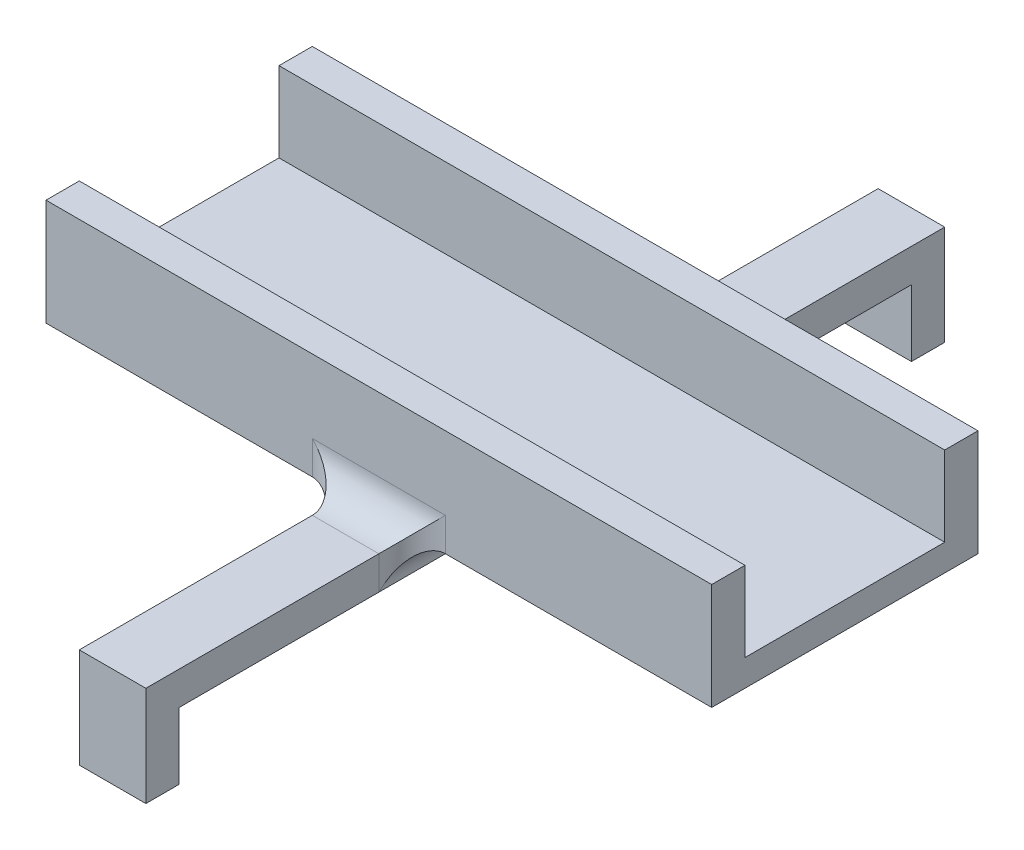
ISO-10303-21;
HEADER;
FILE_DESCRIPTION(('STEP AP214'),'2;1');
FILE_NAME('part.step','',(''),(''),'','','');
FILE_SCHEMA(('AUTOMOTIVE_DESIGN { 1 0 10303 214 1 1 1 1 }'));
ENDSEC;
DATA;
#1=APPLICATION_CONTEXT('core data for automotive mechanical design processes');
#2=APPLICATION_PROTOCOL_DEFINITION('international standard','automotive_design',2000,#1);
#3=PRODUCT_CONTEXT('',#1,'mechanical');
#4=PRODUCT('Part','Part','',(#3));
#5=PRODUCT_RELATED_PRODUCT_CATEGORY('part','',(#4));
#6=PRODUCT_DEFINITION_FORMATION('','',#4);
#7=PRODUCT_DEFINITION_CONTEXT('part definition',#1,'design');
#8=PRODUCT_DEFINITION('design','',#6,#7);
#9=PRODUCT_DEFINITION_SHAPE('','',#8);
#10=(LENGTH_UNIT() NAMED_UNIT(*) SI_UNIT(.MILLI.,.METRE.));
#11=(NAMED_UNIT(*) PLANE_ANGLE_UNIT() SI_UNIT($,.RADIAN.));
#12=(NAMED_UNIT(*) SI_UNIT($,.STERADIAN.) SOLID_ANGLE_UNIT());
#13=UNCERTAINTY_MEASURE_WITH_UNIT(LENGTH_MEASURE(1.E-05),#10,'distance_accuracy_value','');
#14=(GEOMETRIC_REPRESENTATION_CONTEXT(3) GLOBAL_UNCERTAINTY_ASSIGNED_CONTEXT((#13)) GLOBAL_UNIT_ASSIGNED_CONTEXT((#10,
#11,#12)) REPRESENTATION_CONTEXT('',''));
#15=CARTESIAN_POINT('',(0.,0.,0.));
#16=DIRECTION('',(0.,0.,1.));
#17=DIRECTION('',(1.,0.,0.));
#18=AXIS2_PLACEMENT_3D('',#15,#16,#17);
#19=CARTESIAN_POINT('',(-5.,-5.,60.));
#20=DIRECTION('',(1.,0.,0.));
#21=DIRECTION('',(0.,0.,-1.));
#22=AXIS2_PLACEMENT_3D('',#19,#20,#21);
#23=PLANE('',#22);
#24=DIRECTION('',(0.,0.,-1.));
#25=VECTOR('',#24,1.);
#26=CARTESIAN_POINT('',(-5.,-5.,60.));
#27=LINE('',#26,#25);
#28=CARTESIAN_POINT('',(-5.,-5.,-25.));
#29=VERTEX_POINT('',#28);
#30=CARTESIAN_POINT('',(-5.,-5.,-55.));
#31=VERTEX_POINT('',#30);
#32=EDGE_CURVE('E262',#29,#31,#27,.T.);
#33=ORIENTED_EDGE('',*,*,#32,.F.);
#34=DIRECTION('',(0.,1.,0.));
#35=VECTOR('',#34,1.);
#36=CARTESIAN_POINT('',(-5.,0.,-25.));
#37=LINE('',#36,#35);
#38=CARTESIAN_POINT('',(-5.,0.,-25.));
#39=VERTEX_POINT('',#38);
#40=EDGE_CURVE('E416',#29,#39,#37,.T.);
#41=ORIENTED_EDGE('',*,*,#40,.T.);
#42=DIRECTION('',(0.,0.,-1.));
#43=VECTOR('',#42,1.);
#44=CARTESIAN_POINT('',(-5.,0.,60.));
#45=LINE('',#44,#43);
#46=CARTESIAN_POINT('',(-5.,0.,-60.));
#47=VERTEX_POINT('',#46);
#48=EDGE_CURVE('E276',#39,#47,#45,.T.);
#49=ORIENTED_EDGE('',*,*,#48,.T.);
#50=DIRECTION('',(0.,1.,0.));
#51=VECTOR('',#50,1.);
#52=CARTESIAN_POINT('',(-5.,-5.,-60.));
#53=LINE('',#52,#51);
#54=CARTESIAN_POINT('',(-5.,-15.,-60.));
#55=VERTEX_POINT('',#54);
#56=EDGE_CURVE('E286',#55,#47,#53,.T.);
#57=ORIENTED_EDGE('',*,*,#56,.F.);
#58=DIRECTION('',(0.,0.,-1.));
#59=VECTOR('',#58,1.);
#60=CARTESIAN_POINT('',(-5.,-15.,-55.));
#61=LINE('',#60,#59);
#62=CARTESIAN_POINT('',(-5.,-15.,-55.));
#63=VERTEX_POINT('',#62);
#64=EDGE_CURVE('E209',#63,#55,#61,.T.);
#65=ORIENTED_EDGE('',*,*,#64,.F.);
#66=DIRECTION('',(0.,1.,0.));
#67=VECTOR('',#66,1.);
#68=CARTESIAN_POINT('',(-5.,-15.,-55.));
#69=LINE('',#68,#67);
#70=EDGE_CURVE('E204',#63,#31,#69,.T.);
#71=ORIENTED_EDGE('',*,*,#70,.T.);
#72=EDGE_LOOP('',(#33,#41,#49,#57,#65,#71));
#73=FACE_BOUND('',#72,.T.);
#74=ADVANCED_FACE('F38',(#73),#23,.F.);
#75=CARTESIAN_POINT('',(5.,-5.,60.));
#76=DIRECTION('',(-1.,0.,0.));
#77=DIRECTION('',(0.,0.,1.));
#78=AXIS2_PLACEMENT_3D('',#75,#76,#77);
#79=PLANE('',#78);
#80=DIRECTION('',(0.,0.,1.));
#81=VECTOR('',#80,1.);
#82=CARTESIAN_POINT('',(5.,-5.,60.));
#83=LINE('',#82,#81);
#84=CARTESIAN_POINT('',(5.,-5.,25.));
#85=VERTEX_POINT('',#84);
#86=CARTESIAN_POINT('',(5.,-5.,55.));
#87=VERTEX_POINT('',#86);
#88=EDGE_CURVE('E263',#85,#87,#83,.T.);
#89=ORIENTED_EDGE('',*,*,#88,.F.);
#90=DIRECTION('',(0.,1.,0.));
#91=VECTOR('',#90,1.);
#92=CARTESIAN_POINT('',(5.,0.,25.));
#93=LINE('',#92,#91);
#94=CARTESIAN_POINT('',(5.,0.,25.));
#95=VERTEX_POINT('',#94);
#96=EDGE_CURVE('E423',#85,#95,#93,.T.);
#97=ORIENTED_EDGE('',*,*,#96,.T.);
#98=DIRECTION('',(0.,0.,1.));
#99=VECTOR('',#98,1.);
#100=CARTESIAN_POINT('',(5.,0.,60.));
#101=LINE('',#100,#99);
#102=CARTESIAN_POINT('',(5.,0.,60.));
#103=VERTEX_POINT('',#102);
#104=EDGE_CURVE('E259',#95,#103,#101,.T.);
#105=ORIENTED_EDGE('',*,*,#104,.T.);
#106=DIRECTION('',(0.,1.,0.));
#107=VECTOR('',#106,1.);
#108=CARTESIAN_POINT('',(5.,-5.,60.));
#109=LINE('',#108,#107);
#110=CARTESIAN_POINT('',(5.,-15.,60.));
#111=VERTEX_POINT('',#110);
#112=EDGE_CURVE('E294',#111,#103,#109,.T.);
#113=ORIENTED_EDGE('',*,*,#112,.F.);
#114=DIRECTION('',(0.,0.,1.));
#115=VECTOR('',#114,1.);
#116=CARTESIAN_POINT('',(5.,-15.,60.));
#117=LINE('',#116,#115);
#118=CARTESIAN_POINT('',(5.,-15.,55.));
#119=VERTEX_POINT('',#118);
#120=EDGE_CURVE('E233',#119,#111,#117,.T.);
#121=ORIENTED_EDGE('',*,*,#120,.F.);
#122=DIRECTION('',(0.,1.,0.));
#123=VECTOR('',#122,1.);
#124=CARTESIAN_POINT('',(5.,-15.,55.));
#125=LINE('',#124,#123);
#126=EDGE_CURVE('E250',#119,#87,#125,.T.);
#127=ORIENTED_EDGE('',*,*,#126,.T.);
#128=EDGE_LOOP('',(#89,#97,#105,#113,#121,#127));
#129=FACE_BOUND('',#128,.T.);
#130=ADVANCED_FACE('F480',(#129),#79,.F.);
#131=CARTESIAN_POINT('',(0.,-5.,0.));
#132=DIRECTION('',(0.,-1.,0.));
#133=DIRECTION('',(0.,0.,-1.));
#134=AXIS2_PLACEMENT_3D('',#131,#132,#133);
#135=PLANE('',#134);
#136=CARTESIAN_POINT('',(-5.,-5.,55.));
#137=VERTEX_POINT('',#136);
#138=CARTESIAN_POINT('',(-5.,-5.,25.));
#139=VERTEX_POINT('',#138);
#140=EDGE_CURVE('E264',#137,#139,#27,.T.);
#141=ORIENTED_EDGE('',*,*,#140,.T.);
#142=EDGE_CURVE('E269',#139,#29,#27,.T.);
#143=ORIENTED_EDGE('',*,*,#142,.T.);
#144=ORIENTED_EDGE('',*,*,#32,.T.);
#145=DIRECTION('',(-1.,0.,0.));
#146=VECTOR('',#145,1.);
#147=CARTESIAN_POINT('',(-5.,-5.,-55.));
#148=LINE('',#147,#146);
#149=CARTESIAN_POINT('',(5.,-5.,-55.));
#150=VERTEX_POINT('',#149);
#151=EDGE_CURVE('E220',#150,#31,#148,.T.);
#152=ORIENTED_EDGE('',*,*,#151,.F.);
#153=CARTESIAN_POINT('',(5.,-5.,-25.));
#154=VERTEX_POINT('',#153);
#155=EDGE_CURVE('E226',#150,#154,#83,.T.);
#156=ORIENTED_EDGE('',*,*,#155,.T.);
#157=EDGE_CURVE('E57',#154,#85,#83,.T.);
#158=ORIENTED_EDGE('',*,*,#157,.T.);
#159=ORIENTED_EDGE('',*,*,#88,.T.);
#160=DIRECTION('',(1.,0.,0.));
#161=VECTOR('',#160,1.);
#162=CARTESIAN_POINT('',(-5.,-5.,55.));
#163=LINE('',#162,#161);
#164=EDGE_CURVE('E228',#137,#87,#163,.T.);
#165=ORIENTED_EDGE('',*,*,#164,.F.);
#166=EDGE_LOOP('',(#141,#143,#144,#152,#156,#158,#159,#165));
#167=FACE_BOUND('',#166,.T.);
#168=ADVANCED_FACE('F461',(#167),#135,.T.);
#169=CARTESIAN_POINT('',(0.,0.,0.));
#170=DIRECTION('',(0.,1.,0.));
#171=DIRECTION('',(0.,0.,1.));
#172=AXIS2_PLACEMENT_3D('',#169,#170,#171);
#173=PLANE('',#172);
#174=DIRECTION('',(1.,0.,0.));
#175=VECTOR('',#174,1.);
#176=CARTESIAN_POINT('',(-50.,0.,20.));
#177=LINE('',#176,#175);
#178=CARTESIAN_POINT('',(10.,0.,20.));
#179=VERTEX_POINT('',#178);
#180=CARTESIAN_POINT('',(50.,0.,20.));
#181=VERTEX_POINT('',#180);
#182=EDGE_CURVE('E362',#179,#181,#177,.T.);
#183=ORIENTED_EDGE('',*,*,#182,.F.);
#184=DIRECTION('',(0.,0.,1.));
#185=VECTOR('',#184,1.);
#186=CARTESIAN_POINT('',(10.,0.,-20.));
#187=LINE('',#186,#185);
#188=CARTESIAN_POINT('',(10.,0.,-20.));
#189=VERTEX_POINT('',#188);
#190=EDGE_CURVE('E382',#179,#189,#187,.F.);
#191=ORIENTED_EDGE('',*,*,#190,.T.);
#192=DIRECTION('',(-1.,0.,0.));
#193=VECTOR('',#192,1.);
#194=CARTESIAN_POINT('',(-50.,0.,-20.));
#195=LINE('',#194,#193);
#196=CARTESIAN_POINT('',(50.,0.,-20.));
#197=VERTEX_POINT('',#196);
#198=EDGE_CURVE('E355',#197,#189,#195,.T.);
#199=ORIENTED_EDGE('',*,*,#198,.F.);
#200=DIRECTION('',(0.,0.,-1.));
#201=VECTOR('',#200,1.);
#202=CARTESIAN_POINT('',(50.,0.,-20.));
#203=LINE('',#202,#201);
#204=EDGE_CURVE('E324',#181,#197,#203,.T.);
#205=ORIENTED_EDGE('',*,*,#204,.F.);
#206=EDGE_LOOP('',(#183,#191,#199,#205));
#207=FACE_BOUND('',#206,.T.);
#208=ADVANCED_FACE('F567',(#207),#173,.F.);
#209=CARTESIAN_POINT('',(-9.99999999999999,0.,-20.));
#210=VERTEX_POINT('',#209);
#211=CARTESIAN_POINT('',(-50.,0.,-20.));
#212=VERTEX_POINT('',#211);
#213=EDGE_CURVE('E354',#210,#212,#195,.T.);
#214=ORIENTED_EDGE('',*,*,#213,.F.);
#215=DIRECTION('',(0.,0.,-1.));
#216=VECTOR('',#215,1.);
#217=CARTESIAN_POINT('',(-10.,0.,20.));
#218=LINE('',#217,#216);
#219=CARTESIAN_POINT('',(-9.99999999999999,0.,20.));
#220=VERTEX_POINT('',#219);
#221=EDGE_CURVE('E386',#210,#220,#218,.F.);
#222=ORIENTED_EDGE('',*,*,#221,.T.);
#223=CARTESIAN_POINT('',(-50.,0.,20.));
#224=VERTEX_POINT('',#223);
#225=EDGE_CURVE('E363',#224,#220,#177,.T.);
#226=ORIENTED_EDGE('',*,*,#225,.F.);
#227=DIRECTION('',(0.,0.,1.));
#228=VECTOR('',#227,1.);
#229=CARTESIAN_POINT('',(-50.,0.,-20.));
#230=LINE('',#229,#228);
#231=EDGE_CURVE('E359',#212,#224,#230,.T.);
#232=ORIENTED_EDGE('',*,*,#231,.F.);
#233=EDGE_LOOP('',(#214,#222,#226,#232));
#234=FACE_BOUND('',#233,.T.);
#235=ADVANCED_FACE('F521',(#234),#173,.F.);
#236=CARTESIAN_POINT('',(0.,16.,0.));
#237=DIRECTION('',(0.,1.,0.));
#238=DIRECTION('',(0.,0.,1.));
#239=AXIS2_PLACEMENT_3D('',#236,#237,#238);
#240=PLANE('',#239);
#241=DIRECTION('',(1.,0.,0.));
#242=VECTOR('',#241,1.);
#243=CARTESIAN_POINT('',(-50.,16.,15.));
#244=LINE('',#243,#242);
#245=CARTESIAN_POINT('',(-50.,16.,15.));
#246=VERTEX_POINT('',#245);
#247=CARTESIAN_POINT('',(50.,16.,15.));
#248=VERTEX_POINT('',#247);
#249=EDGE_CURVE('E304',#246,#248,#244,.T.);
#250=ORIENTED_EDGE('',*,*,#249,.F.);
#251=DIRECTION('',(0.,0.,1.));
#252=VECTOR('',#251,1.);
#253=CARTESIAN_POINT('',(-50.,16.,-20.));
#254=LINE('',#253,#252);
#255=CARTESIAN_POINT('',(-50.,16.,20.));
#256=VERTEX_POINT('',#255);
#257=EDGE_CURVE('E342',#246,#256,#254,.T.);
#258=ORIENTED_EDGE('',*,*,#257,.T.);
#259=DIRECTION('',(1.,0.,0.));
#260=VECTOR('',#259,1.);
#261=CARTESIAN_POINT('',(-50.,16.,20.));
#262=LINE('',#261,#260);
#263=CARTESIAN_POINT('',(50.,16.,20.));
#264=VERTEX_POINT('',#263);
#265=EDGE_CURVE('E347',#256,#264,#262,.T.);
#266=ORIENTED_EDGE('',*,*,#265,.T.);
#267=DIRECTION('',(0.,0.,-1.));
#268=VECTOR('',#267,1.);
#269=CARTESIAN_POINT('',(50.,16.,-20.));
#270=LINE('',#269,#268);
#271=EDGE_CURVE('E334',#264,#248,#270,.T.);
#272=ORIENTED_EDGE('',*,*,#271,.T.);
#273=EDGE_LOOP('',(#250,#258,#266,#272));
#274=FACE_BOUND('',#273,.T.);
#275=ADVANCED_FACE('F538',(#274),#240,.T.);
#276=CARTESIAN_POINT('',(50.,16.,-20.));
#277=DIRECTION('',(-1.,0.,0.));
#278=DIRECTION('',(0.,0.,1.));
#279=AXIS2_PLACEMENT_3D('',#276,#277,#278);
#280=PLANE('',#279);
#281=DIRECTION('',(0.,0.,-1.));
#282=VECTOR('',#281,1.);
#283=CARTESIAN_POINT('',(50.,4.,-15.));
#284=LINE('',#283,#282);
#285=CARTESIAN_POINT('',(50.,4.,15.));
#286=VERTEX_POINT('',#285);
#287=CARTESIAN_POINT('',(50.,4.,-15.));
#288=VERTEX_POINT('',#287);
#289=EDGE_CURVE('E299',#286,#288,#284,.T.);
#290=ORIENTED_EDGE('',*,*,#289,.F.);
#291=DIRECTION('',(0.,1.,0.));
#292=VECTOR('',#291,1.);
#293=CARTESIAN_POINT('',(50.,4.,15.));
#294=LINE('',#293,#292);
#295=EDGE_CURVE('E320',#286,#248,#294,.T.);
#296=ORIENTED_EDGE('',*,*,#295,.T.);
#297=ORIENTED_EDGE('',*,*,#271,.F.);
#298=DIRECTION('',(0.,-1.,0.));
#299=VECTOR('',#298,1.);
#300=CARTESIAN_POINT('',(50.,16.,20.));
#301=LINE('',#300,#299);
#302=EDGE_CURVE('E350',#264,#181,#301,.T.);
#303=ORIENTED_EDGE('',*,*,#302,.T.);
#304=ORIENTED_EDGE('',*,*,#204,.T.);
#305=DIRECTION('',(0.,-1.,0.));
#306=VECTOR('',#305,1.);
#307=CARTESIAN_POINT('',(50.,16.,-20.));
#308=LINE('',#307,#306);
#309=CARTESIAN_POINT('',(50.,16.,-20.));
#310=VERTEX_POINT('',#309);
#311=EDGE_CURVE('E378',#310,#197,#308,.T.);
#312=ORIENTED_EDGE('',*,*,#311,.F.);
#313=CARTESIAN_POINT('',(50.,16.,-15.));
#314=VERTEX_POINT('',#313);
#315=EDGE_CURVE('E339',#314,#310,#270,.T.);
#316=ORIENTED_EDGE('',*,*,#315,.F.);
#317=DIRECTION('',(0.,1.,0.));
#318=VECTOR('',#317,1.);
#319=CARTESIAN_POINT('',(50.,4.,-15.));
#320=LINE('',#319,#318);
#321=EDGE_CURVE('E315',#288,#314,#320,.T.);
#322=ORIENTED_EDGE('',*,*,#321,.F.);
#323=EDGE_LOOP('',(#290,#296,#297,#303,#304,#312,#316,#322));
#324=FACE_BOUND('',#323,.T.);
#325=ADVANCED_FACE('F547',(#324),#280,.F.);
#326=CARTESIAN_POINT('',(-50.,16.,-20.));
#327=DIRECTION('',(0.,0.,1.));
#328=DIRECTION('',(1.,0.,0.));
#329=AXIS2_PLACEMENT_3D('',#326,#327,#328);
#330=PLANE('',#329);
#331=DIRECTION('',(-1.,0.,0.));
#332=VECTOR('',#331,1.);
#333=CARTESIAN_POINT('',(-5.,5.,-20.));
#334=LINE('',#333,#332);
#335=CARTESIAN_POINT('',(10.,5.,-20.));
#336=VERTEX_POINT('',#335);
#337=CARTESIAN_POINT('',(-10.,5.,-20.));
#338=VERTEX_POINT('',#337);
#339=EDGE_CURVE('E406',#336,#338,#334,.T.);
#340=ORIENTED_EDGE('',*,*,#339,.T.);
#341=DIRECTION('',(0.,1.,0.));
#342=VECTOR('',#341,1.);
#343=CARTESIAN_POINT('',(-10.,-5.,-20.));
#344=LINE('',#343,#342);
#345=EDGE_CURVE('E410',#338,#210,#344,.F.);
#346=ORIENTED_EDGE('',*,*,#345,.T.);
#347=ORIENTED_EDGE('',*,*,#213,.T.);
#348=DIRECTION('',(0.,-1.,0.));
#349=VECTOR('',#348,1.);
#350=CARTESIAN_POINT('',(-50.,16.,-20.));
#351=LINE('',#350,#349);
#352=CARTESIAN_POINT('',(-50.,16.,-20.));
#353=VERTEX_POINT('',#352);
#354=EDGE_CURVE('E374',#353,#212,#351,.T.);
#355=ORIENTED_EDGE('',*,*,#354,.F.);
#356=DIRECTION('',(-1.,0.,0.));
#357=VECTOR('',#356,1.);
#358=CARTESIAN_POINT('',(-50.,16.,-20.));
#359=LINE('',#358,#357);
#360=EDGE_CURVE('E338',#310,#353,#359,.T.);
#361=ORIENTED_EDGE('',*,*,#360,.F.);
#362=ORIENTED_EDGE('',*,*,#311,.T.);
#363=ORIENTED_EDGE('',*,*,#198,.T.);
#364=DIRECTION('',(0.,-1.,0.));
#365=VECTOR('',#364,1.);
#366=CARTESIAN_POINT('',(10.,0.,-20.));
#367=LINE('',#366,#365);
#368=EDGE_CURVE('E403',#189,#336,#367,.F.);
#369=ORIENTED_EDGE('',*,*,#368,.T.);
#370=EDGE_LOOP('',(#340,#346,#347,#355,#361,#362,#363,#369));
#371=FACE_BOUND('',#370,.T.);
#372=ADVANCED_FACE('F565',(#371),#330,.F.);
#373=CARTESIAN_POINT('',(-50.,16.,-20.));
#374=DIRECTION('',(1.,0.,0.));
#375=DIRECTION('',(0.,0.,-1.));
#376=AXIS2_PLACEMENT_3D('',#373,#374,#375);
#377=PLANE('',#376);
#378=ORIENTED_EDGE('',*,*,#257,.F.);
#379=DIRECTION('',(0.,1.,0.));
#380=VECTOR('',#379,1.);
#381=CARTESIAN_POINT('',(-50.,4.,15.));
#382=LINE('',#381,#380);
#383=CARTESIAN_POINT('',(-50.,4.,15.));
#384=VERTEX_POINT('',#383);
#385=EDGE_CURVE('E325',#384,#246,#382,.T.);
#386=ORIENTED_EDGE('',*,*,#385,.F.);
#387=DIRECTION('',(0.,0.,1.));
#388=VECTOR('',#387,1.);
#389=CARTESIAN_POINT('',(-50.,4.,-15.));
#390=LINE('',#389,#388);
#391=CARTESIAN_POINT('',(-50.,4.,-15.));
#392=VERTEX_POINT('',#391);
#393=EDGE_CURVE('E308',#392,#384,#390,.T.);
#394=ORIENTED_EDGE('',*,*,#393,.F.);
#395=DIRECTION('',(0.,1.,0.));
#396=VECTOR('',#395,1.);
#397=CARTESIAN_POINT('',(-50.,4.,-15.));
#398=LINE('',#397,#396);
#399=CARTESIAN_POINT('',(-50.,16.,-15.));
#400=VERTEX_POINT('',#399);
#401=EDGE_CURVE('E328',#392,#400,#398,.T.);
#402=ORIENTED_EDGE('',*,*,#401,.T.);
#403=EDGE_CURVE('E343',#353,#400,#254,.T.);
#404=ORIENTED_EDGE('',*,*,#403,.F.);
#405=ORIENTED_EDGE('',*,*,#354,.T.);
#406=ORIENTED_EDGE('',*,*,#231,.T.);
#407=DIRECTION('',(0.,-1.,0.));
#408=VECTOR('',#407,1.);
#409=CARTESIAN_POINT('',(-50.,16.,20.));
#410=LINE('',#409,#408);
#411=EDGE_CURVE('E370',#256,#224,#410,.T.);
#412=ORIENTED_EDGE('',*,*,#411,.F.);
#413=EDGE_LOOP('',(#378,#386,#394,#402,#404,#405,#406,#412));
#414=FACE_BOUND('',#413,.T.);
#415=ADVANCED_FACE('F542',(#414),#377,.F.);
#416=CARTESIAN_POINT('',(-50.,16.,20.));
#417=DIRECTION('',(0.,0.,-1.));
#418=DIRECTION('',(-1.,0.,0.));
#419=AXIS2_PLACEMENT_3D('',#416,#417,#418);
#420=PLANE('',#419);
#421=ORIENTED_EDGE('',*,*,#225,.T.);
#422=DIRECTION('',(0.,-1.,0.));
#423=VECTOR('',#422,1.);
#424=CARTESIAN_POINT('',(-10.,0.,20.));
#425=LINE('',#424,#423);
#426=CARTESIAN_POINT('',(-10.,5.,20.));
#427=VERTEX_POINT('',#426);
#428=EDGE_CURVE('E397',#220,#427,#425,.F.);
#429=ORIENTED_EDGE('',*,*,#428,.T.);
#430=DIRECTION('',(1.,0.,0.));
#431=VECTOR('',#430,1.);
#432=CARTESIAN_POINT('',(5.,5.,20.));
#433=LINE('',#432,#431);
#434=CARTESIAN_POINT('',(10.,5.,20.));
#435=VERTEX_POINT('',#434);
#436=EDGE_CURVE('E393',#427,#435,#433,.T.);
#437=ORIENTED_EDGE('',*,*,#436,.T.);
#438=DIRECTION('',(0.,1.,0.));
#439=VECTOR('',#438,1.);
#440=CARTESIAN_POINT('',(10.,-5.,20.));
#441=LINE('',#440,#439);
#442=EDGE_CURVE('E390',#435,#179,#441,.F.);
#443=ORIENTED_EDGE('',*,*,#442,.T.);
#444=ORIENTED_EDGE('',*,*,#182,.T.);
#445=ORIENTED_EDGE('',*,*,#302,.F.);
#446=ORIENTED_EDGE('',*,*,#265,.F.);
#447=ORIENTED_EDGE('',*,*,#411,.T.);
#448=EDGE_LOOP('',(#421,#429,#437,#443,#444,#445,#446,#447));
#449=FACE_BOUND('',#448,.T.);
#450=ADVANCED_FACE('F513',(#449),#420,.F.);
#451=DIRECTION('',(-1.,0.,0.));
#452=VECTOR('',#451,1.);
#453=CARTESIAN_POINT('',(-50.,16.,-15.));
#454=LINE('',#453,#452);
#455=EDGE_CURVE('E298',#314,#400,#454,.T.);
#456=ORIENTED_EDGE('',*,*,#455,.F.);
#457=ORIENTED_EDGE('',*,*,#315,.T.);
#458=ORIENTED_EDGE('',*,*,#360,.T.);
#459=ORIENTED_EDGE('',*,*,#403,.T.);
#460=EDGE_LOOP('',(#456,#457,#458,#459));
#461=FACE_BOUND('',#460,.T.);
#462=ADVANCED_FACE('F559',(#461),#240,.T.);
#463=CARTESIAN_POINT('',(-50.,4.,15.));
#464=DIRECTION('',(0.,0.,1.));
#465=DIRECTION('',(1.,0.,0.));
#466=AXIS2_PLACEMENT_3D('',#463,#464,#465);
#467=PLANE('',#466);
#468=ORIENTED_EDGE('',*,*,#249,.T.);
#469=ORIENTED_EDGE('',*,*,#295,.F.);
#470=DIRECTION('',(1.,0.,0.));
#471=VECTOR('',#470,1.);
#472=CARTESIAN_POINT('',(-50.,4.,15.));
#473=LINE('',#472,#471);
#474=EDGE_CURVE('E311',#384,#286,#473,.T.);
#475=ORIENTED_EDGE('',*,*,#474,.F.);
#476=ORIENTED_EDGE('',*,*,#385,.T.);
#477=EDGE_LOOP('',(#468,#469,#475,#476));
#478=FACE_BOUND('',#477,.T.);
#479=ADVANCED_FACE('F551',(#478),#467,.F.);
#480=CARTESIAN_POINT('',(-50.,4.,-15.));
#481=DIRECTION('',(0.,0.,-1.));
#482=DIRECTION('',(-1.,0.,0.));
#483=AXIS2_PLACEMENT_3D('',#480,#481,#482);
#484=PLANE('',#483);
#485=ORIENTED_EDGE('',*,*,#455,.T.);
#486=ORIENTED_EDGE('',*,*,#401,.F.);
#487=DIRECTION('',(-1.,0.,0.));
#488=VECTOR('',#487,1.);
#489=CARTESIAN_POINT('',(-50.,4.,-15.));
#490=LINE('',#489,#488);
#491=EDGE_CURVE('E303',#288,#392,#490,.T.);
#492=ORIENTED_EDGE('',*,*,#491,.F.);
#493=ORIENTED_EDGE('',*,*,#321,.T.);
#494=EDGE_LOOP('',(#485,#486,#492,#493));
#495=FACE_BOUND('',#494,.T.);
#496=ADVANCED_FACE('F604',(#495),#484,.F.);
#497=CARTESIAN_POINT('',(0.,4.,0.));
#498=DIRECTION('',(0.,1.,0.));
#499=DIRECTION('',(0.,0.,1.));
#500=AXIS2_PLACEMENT_3D('',#497,#498,#499);
#501=PLANE('',#500);
#502=ORIENTED_EDGE('',*,*,#289,.T.);
#503=ORIENTED_EDGE('',*,*,#491,.T.);
#504=ORIENTED_EDGE('',*,*,#393,.T.);
#505=ORIENTED_EDGE('',*,*,#474,.T.);
#506=EDGE_LOOP('',(#502,#503,#504,#505));
#507=FACE_BOUND('',#506,.T.);
#508=ADVANCED_FACE('F553',(#507),#501,.T.);
#509=CARTESIAN_POINT('',(0.,0.,0.));
#510=DIRECTION('',(0.,-1.,0.));
#511=DIRECTION('',(0.,0.,-1.));
#512=AXIS2_PLACEMENT_3D('',#509,#510,#511);
#513=PLANE('',#512);
#514=ORIENTED_EDGE('',*,*,#104,.F.);
#515=DIRECTION('',(1.,0.,0.));
#516=VECTOR('',#515,1.);
#517=CARTESIAN_POINT('',(-5.,0.,25.));
#518=LINE('',#517,#516);
#519=CARTESIAN_POINT('',(-5.,0.,25.));
#520=VERTEX_POINT('',#519);
#521=EDGE_CURVE('E400',#95,#520,#518,.F.);
#522=ORIENTED_EDGE('',*,*,#521,.T.);
#523=CARTESIAN_POINT('',(-5.,0.,60.));
#524=VERTEX_POINT('',#523);
#525=EDGE_CURVE('E277',#524,#520,#45,.T.);
#526=ORIENTED_EDGE('',*,*,#525,.F.);
#527=DIRECTION('',(-1.,0.,0.));
#528=VECTOR('',#527,1.);
#529=CARTESIAN_POINT('',(-5.,0.,60.));
#530=LINE('',#529,#528);
#531=EDGE_CURVE('E273',#103,#524,#530,.T.);
#532=ORIENTED_EDGE('',*,*,#531,.F.);
#533=EDGE_LOOP('',(#514,#522,#526,#532));
#534=FACE_BOUND('',#533,.T.);
#535=ADVANCED_FACE('F487',(#534),#513,.F.);
#536=CARTESIAN_POINT('',(5.,0.,-60.));
#537=VERTEX_POINT('',#536);
#538=CARTESIAN_POINT('',(5.,0.,-25.));
#539=VERTEX_POINT('',#538);
#540=EDGE_CURVE('E270',#537,#539,#101,.T.);
#541=ORIENTED_EDGE('',*,*,#540,.T.);
#542=DIRECTION('',(0.,-1.,0.));
#543=VECTOR('',#542,1.);
#544=CARTESIAN_POINT('',(5.,-5.,-25.));
#545=LINE('',#544,#543);
#546=EDGE_CURVE('E426',#539,#154,#545,.T.);
#547=ORIENTED_EDGE('',*,*,#546,.T.);
#548=ORIENTED_EDGE('',*,*,#155,.F.);
#549=DIRECTION('',(0.,1.,0.));
#550=VECTOR('',#549,1.);
#551=CARTESIAN_POINT('',(5.,-15.,-55.));
#552=LINE('',#551,#550);
#553=CARTESIAN_POINT('',(5.,-15.,-55.));
#554=VERTEX_POINT('',#553);
#555=EDGE_CURVE('E202',#554,#150,#552,.T.);
#556=ORIENTED_EDGE('',*,*,#555,.F.);
#557=DIRECTION('',(0.,0.,1.));
#558=VECTOR('',#557,1.);
#559=CARTESIAN_POINT('',(5.,-15.,-55.));
#560=LINE('',#559,#558);
#561=CARTESIAN_POINT('',(5.,-15.,-60.));
#562=VERTEX_POINT('',#561);
#563=EDGE_CURVE('E210',#562,#554,#560,.T.);
#564=ORIENTED_EDGE('',*,*,#563,.F.);
#565=DIRECTION('',(0.,1.,0.));
#566=VECTOR('',#565,1.);
#567=CARTESIAN_POINT('',(5.,-5.,-60.));
#568=LINE('',#567,#566);
#569=EDGE_CURVE('E268',#562,#537,#568,.T.);
#570=ORIENTED_EDGE('',*,*,#569,.T.);
#571=EDGE_LOOP('',(#541,#547,#548,#556,#564,#570));
#572=FACE_BOUND('',#571,.T.);
#573=ADVANCED_FACE('F224',(#572),#79,.F.);
#574=CARTESIAN_POINT('',(-5.,-5.,60.));
#575=DIRECTION('',(0.,0.,-1.));
#576=DIRECTION('',(-1.,0.,0.));
#577=AXIS2_PLACEMENT_3D('',#574,#575,#576);
#578=PLANE('',#577);
#579=ORIENTED_EDGE('',*,*,#531,.T.);
#580=DIRECTION('',(0.,1.,0.));
#581=VECTOR('',#580,1.);
#582=CARTESIAN_POINT('',(-5.,-5.,60.));
#583=LINE('',#582,#581);
#584=CARTESIAN_POINT('',(-5.,-15.,60.));
#585=VERTEX_POINT('',#584);
#586=EDGE_CURVE('E290',#585,#524,#583,.T.);
#587=ORIENTED_EDGE('',*,*,#586,.F.);
#588=DIRECTION('',(-1.,0.,0.));
#589=VECTOR('',#588,1.);
#590=CARTESIAN_POINT('',(-5.,-15.,60.));
#591=LINE('',#590,#589);
#592=EDGE_CURVE('E241',#111,#585,#591,.T.);
#593=ORIENTED_EDGE('',*,*,#592,.F.);
#594=ORIENTED_EDGE('',*,*,#112,.T.);
#595=EDGE_LOOP('',(#579,#587,#593,#594));
#596=FACE_BOUND('',#595,.T.);
#597=ADVANCED_FACE('F489',(#596),#578,.F.);
#598=ORIENTED_EDGE('',*,*,#525,.T.);
#599=DIRECTION('',(0.,-1.,0.));
#600=VECTOR('',#599,1.);
#601=CARTESIAN_POINT('',(-5.,-5.,25.));
#602=LINE('',#601,#600);
#603=EDGE_CURVE('E419',#520,#139,#602,.T.);
#604=ORIENTED_EDGE('',*,*,#603,.T.);
#605=ORIENTED_EDGE('',*,*,#140,.F.);
#606=DIRECTION('',(0.,1.,0.));
#607=VECTOR('',#606,1.);
#608=CARTESIAN_POINT('',(-5.,-15.,55.));
#609=LINE('',#608,#607);
#610=CARTESIAN_POINT('',(-5.,-15.,55.));
#611=VERTEX_POINT('',#610);
#612=EDGE_CURVE('E255',#611,#137,#609,.T.);
#613=ORIENTED_EDGE('',*,*,#612,.F.);
#614=DIRECTION('',(0.,0.,-1.));
#615=VECTOR('',#614,1.);
#616=CARTESIAN_POINT('',(-5.,-15.,60.));
#617=LINE('',#616,#615);
#618=EDGE_CURVE('E245',#585,#611,#617,.T.);
#619=ORIENTED_EDGE('',*,*,#618,.F.);
#620=ORIENTED_EDGE('',*,*,#586,.T.);
#621=EDGE_LOOP('',(#598,#604,#605,#613,#619,#620));
#622=FACE_BOUND('',#621,.T.);
#623=ADVANCED_FACE('F501',(#622),#23,.F.);
#624=CARTESIAN_POINT('',(-5.,-5.,-60.));
#625=DIRECTION('',(0.,0.,1.));
#626=DIRECTION('',(1.,0.,0.));
#627=AXIS2_PLACEMENT_3D('',#624,#625,#626);
#628=PLANE('',#627);
#629=DIRECTION('',(1.,0.,0.));
#630=VECTOR('',#629,1.);
#631=CARTESIAN_POINT('',(-5.,0.,-60.));
#632=LINE('',#631,#630);
#633=EDGE_CURVE('E281',#47,#537,#632,.T.);
#634=ORIENTED_EDGE('',*,*,#633,.T.);
#635=ORIENTED_EDGE('',*,*,#569,.F.);
#636=DIRECTION('',(1.,0.,0.));
#637=VECTOR('',#636,1.);
#638=CARTESIAN_POINT('',(-5.,-15.,-60.));
#639=LINE('',#638,#637);
#640=EDGE_CURVE('E216',#55,#562,#639,.T.);
#641=ORIENTED_EDGE('',*,*,#640,.F.);
#642=ORIENTED_EDGE('',*,*,#56,.T.);
#643=EDGE_LOOP('',(#634,#635,#641,#642));
#644=FACE_BOUND('',#643,.T.);
#645=ADVANCED_FACE('F470',(#644),#628,.F.);
#646=ORIENTED_EDGE('',*,*,#48,.F.);
#647=DIRECTION('',(-1.,0.,0.));
#648=VECTOR('',#647,1.);
#649=CARTESIAN_POINT('',(5.,0.,-25.));
#650=LINE('',#649,#648);
#651=EDGE_CURVE('E413',#39,#539,#650,.F.);
#652=ORIENTED_EDGE('',*,*,#651,.T.);
#653=ORIENTED_EDGE('',*,*,#540,.F.);
#654=ORIENTED_EDGE('',*,*,#633,.F.);
#655=EDGE_LOOP('',(#646,#652,#653,#654));
#656=FACE_BOUND('',#655,.T.);
#657=ADVANCED_FACE('F474',(#656),#513,.F.);
#658=CARTESIAN_POINT('',(-5.,-15.,55.));
#659=DIRECTION('',(0.,0.,1.));
#660=DIRECTION('',(1.,0.,0.));
#661=AXIS2_PLACEMENT_3D('',#658,#659,#660);
#662=PLANE('',#661);
#663=ORIENTED_EDGE('',*,*,#164,.T.);
#664=ORIENTED_EDGE('',*,*,#126,.F.);
#665=DIRECTION('',(1.,0.,0.));
#666=VECTOR('',#665,1.);
#667=CARTESIAN_POINT('',(-5.,-15.,55.));
#668=LINE('',#667,#666);
#669=EDGE_CURVE('E248',#611,#119,#668,.T.);
#670=ORIENTED_EDGE('',*,*,#669,.F.);
#671=ORIENTED_EDGE('',*,*,#612,.T.);
#672=EDGE_LOOP('',(#663,#664,#670,#671));
#673=FACE_BOUND('',#672,.T.);
#674=ADVANCED_FACE('F496',(#673),#662,.F.);
#675=CARTESIAN_POINT('',(0.,-15.,0.));
#676=DIRECTION('',(0.,-1.,0.));
#677=DIRECTION('',(0.,0.,-1.));
#678=AXIS2_PLACEMENT_3D('',#675,#676,#677);
#679=PLANE('',#678);
#680=ORIENTED_EDGE('',*,*,#120,.T.);
#681=ORIENTED_EDGE('',*,*,#592,.T.);
#682=ORIENTED_EDGE('',*,*,#618,.T.);
#683=ORIENTED_EDGE('',*,*,#669,.T.);
#684=EDGE_LOOP('',(#680,#681,#682,#683));
#685=FACE_BOUND('',#684,.T.);
#686=ADVANCED_FACE('F492',(#685),#679,.T.);
#687=CARTESIAN_POINT('',(-5.,-15.,-55.));
#688=DIRECTION('',(0.,0.,-1.));
#689=DIRECTION('',(-1.,0.,0.));
#690=AXIS2_PLACEMENT_3D('',#687,#688,#689);
#691=PLANE('',#690);
#692=ORIENTED_EDGE('',*,*,#151,.T.);
#693=ORIENTED_EDGE('',*,*,#70,.F.);
#694=DIRECTION('',(-1.,0.,0.));
#695=VECTOR('',#694,1.);
#696=CARTESIAN_POINT('',(-5.,-15.,-55.));
#697=LINE('',#696,#695);
#698=EDGE_CURVE('E197',#554,#63,#697,.T.);
#699=ORIENTED_EDGE('',*,*,#698,.F.);
#700=ORIENTED_EDGE('',*,*,#555,.T.);
#701=EDGE_LOOP('',(#692,#693,#699,#700));
#702=FACE_BOUND('',#701,.T.);
#703=ADVANCED_FACE('F200',(#702),#691,.F.);
#704=CARTESIAN_POINT('',(0.,-15.,0.));
#705=DIRECTION('',(0.,-1.,0.));
#706=DIRECTION('',(0.,0.,-1.));
#707=AXIS2_PLACEMENT_3D('',#704,#705,#706);
#708=PLANE('',#707);
#709=ORIENTED_EDGE('',*,*,#563,.T.);
#710=ORIENTED_EDGE('',*,*,#698,.T.);
#711=ORIENTED_EDGE('',*,*,#64,.T.);
#712=ORIENTED_EDGE('',*,*,#640,.T.);
#713=EDGE_LOOP('',(#709,#710,#711,#712));
#714=FACE_BOUND('',#713,.T.);
#715=ADVANCED_FACE('F214',(#714),#708,.T.);
#716=CARTESIAN_POINT('',(10.,-5.,60.));
#717=DIRECTION('',(0.,0.,-1.));
#718=DIRECTION('',(-1.,0.,0.));
#719=AXIS2_PLACEMENT_3D('',#716,#717,#718);
#720=CYLINDRICAL_SURFACE('',#719,5.);
#721=ORIENTED_EDGE('',*,*,#157,.F.);
#722=CARTESIAN_POINT('',(10.,-5.,-25.));
#723=DIRECTION('',(0.,0.707106781186547,-0.707106781186547));
#724=DIRECTION('',(0.,-0.707106781186547,-0.707106781186547));
#725=AXIS2_PLACEMENT_3D('',#722,#723,#724);
#726=ELLIPSE('',#725,7.07106781186547,5.);
#727=EDGE_CURVE('E11',#154,#189,#726,.T.);
#728=ORIENTED_EDGE('',*,*,#727,.T.);
#729=ORIENTED_EDGE('',*,*,#190,.F.);
#730=CARTESIAN_POINT('',(10.,-5.,25.));
#731=DIRECTION('',(0.,-0.707106781186547,-0.707106781186547));
#732=DIRECTION('',(0.,0.707106781186547,-0.707106781186547));
#733=AXIS2_PLACEMENT_3D('',#730,#731,#732);
#734=ELLIPSE('',#733,7.07106781186547,5.);
#735=EDGE_CURVE('E49',#179,#85,#734,.F.);
#736=ORIENTED_EDGE('',*,*,#735,.T.);
#737=EDGE_LOOP('',(#721,#728,#729,#736));
#738=FACE_BOUND('',#737,.T.);
#739=ADVANCED_FACE('F571',(#738),#720,.F.);
#740=CARTESIAN_POINT('',(-10.,-5.,60.));
#741=DIRECTION('',(0.,0.,1.));
#742=DIRECTION('',(1.,0.,0.));
#743=AXIS2_PLACEMENT_3D('',#740,#741,#742);
#744=CYLINDRICAL_SURFACE('',#743,5.);
#745=ORIENTED_EDGE('',*,*,#142,.F.);
#746=CARTESIAN_POINT('',(-10.,-5.,25.));
#747=DIRECTION('',(0.,0.707106781186547,0.707106781186547));
#748=DIRECTION('',(0.,-0.707106781186547,0.707106781186547));
#749=AXIS2_PLACEMENT_3D('',#746,#747,#748);
#750=ELLIPSE('',#749,7.07106781186547,5.);
#751=EDGE_CURVE('E433',#139,#220,#750,.T.);
#752=ORIENTED_EDGE('',*,*,#751,.T.);
#753=ORIENTED_EDGE('',*,*,#221,.F.);
#754=CARTESIAN_POINT('',(-10.,-5.,-25.));
#755=DIRECTION('',(0.,-0.707106781186547,0.707106781186547));
#756=DIRECTION('',(0.,0.707106781186547,0.707106781186547));
#757=AXIS2_PLACEMENT_3D('',#754,#755,#756);
#758=ELLIPSE('',#757,7.07106781186547,5.);
#759=EDGE_CURVE('E429',#210,#29,#758,.F.);
#760=ORIENTED_EDGE('',*,*,#759,.T.);
#761=EDGE_LOOP('',(#745,#752,#753,#760));
#762=FACE_BOUND('',#761,.T.);
#763=ADVANCED_FACE('F525',(#762),#744,.F.);
#764=CARTESIAN_POINT('',(-10.,-5.,25.));
#765=DIRECTION('',(0.,1.,0.));
#766=DIRECTION('',(0.,0.,1.));
#767=AXIS2_PLACEMENT_3D('',#764,#765,#766);
#768=CYLINDRICAL_SURFACE('',#767,5.);
#769=ORIENTED_EDGE('',*,*,#751,.F.);
#770=ORIENTED_EDGE('',*,*,#603,.F.);
#771=CARTESIAN_POINT('',(-10.,5.,25.));
#772=DIRECTION('',(0.707106781186547,0.707106781186547,0.));
#773=DIRECTION('',(-0.707106781186547,0.707106781186547,0.));
#774=AXIS2_PLACEMENT_3D('',#771,#772,#773);
#775=ELLIPSE('',#774,7.07106781186547,5.);
#776=EDGE_CURVE('E442',#427,#520,#775,.F.);
#777=ORIENTED_EDGE('',*,*,#776,.F.);
#778=ORIENTED_EDGE('',*,*,#428,.F.);
#779=EDGE_LOOP('',(#769,#770,#777,#778));
#780=FACE_BOUND('',#779,.T.);
#781=ADVANCED_FACE('F505',(#780),#768,.F.);
#782=CARTESIAN_POINT('',(10.,-5.,25.));
#783=DIRECTION('',(0.,-1.,0.));
#784=DIRECTION('',(0.,0.,-1.));
#785=AXIS2_PLACEMENT_3D('',#782,#783,#784);
#786=CYLINDRICAL_SURFACE('',#785,5.);
#787=ORIENTED_EDGE('',*,*,#735,.F.);
#788=ORIENTED_EDGE('',*,*,#442,.F.);
#789=CARTESIAN_POINT('',(10.,5.,25.));
#790=DIRECTION('',(0.707106781186547,-0.707106781186547,0.));
#791=DIRECTION('',(-0.707106781186547,-0.707106781186547,0.));
#792=AXIS2_PLACEMENT_3D('',#789,#790,#791);
#793=ELLIPSE('',#792,7.07106781186547,5.);
#794=EDGE_CURVE('E439',#95,#435,#793,.T.);
#795=ORIENTED_EDGE('',*,*,#794,.F.);
#796=ORIENTED_EDGE('',*,*,#96,.F.);
#797=EDGE_LOOP('',(#787,#788,#795,#796));
#798=FACE_BOUND('',#797,.T.);
#799=ADVANCED_FACE('F573',(#798),#786,.F.);
#800=CARTESIAN_POINT('',(-50.,5.,25.));
#801=DIRECTION('',(-1.,0.,0.));
#802=DIRECTION('',(0.,0.,1.));
#803=AXIS2_PLACEMENT_3D('',#800,#801,#802);
#804=CYLINDRICAL_SURFACE('',#803,5.);
#805=ORIENTED_EDGE('',*,*,#776,.T.);
#806=ORIENTED_EDGE('',*,*,#521,.F.);
#807=ORIENTED_EDGE('',*,*,#794,.T.);
#808=ORIENTED_EDGE('',*,*,#436,.F.);
#809=EDGE_LOOP('',(#805,#806,#807,#808));
#810=FACE_BOUND('',#809,.T.);
#811=ADVANCED_FACE('F509',(#810),#804,.F.);
#812=CARTESIAN_POINT('',(10.,-5.,-25.));
#813=DIRECTION('',(0.,1.,0.));
#814=DIRECTION('',(0.,0.,1.));
#815=AXIS2_PLACEMENT_3D('',#812,#813,#814);
#816=CYLINDRICAL_SURFACE('',#815,5.);
#817=ORIENTED_EDGE('',*,*,#727,.F.);
#818=ORIENTED_EDGE('',*,*,#546,.F.);
#819=CARTESIAN_POINT('',(10.,5.,-25.));
#820=DIRECTION('',(-0.707106781186547,0.707106781186547,0.));
#821=DIRECTION('',(0.707106781186547,0.707106781186547,0.));
#822=AXIS2_PLACEMENT_3D('',#819,#820,#821);
#823=ELLIPSE('',#822,7.07106781186547,5.);
#824=EDGE_CURVE('E42',#336,#539,#823,.F.);
#825=ORIENTED_EDGE('',*,*,#824,.F.);
#826=ORIENTED_EDGE('',*,*,#368,.F.);
#827=EDGE_LOOP('',(#817,#818,#825,#826));
#828=FACE_BOUND('',#827,.T.);
#829=ADVANCED_FACE('F40',(#828),#816,.F.);
#830=CARTESIAN_POINT('',(-10.,-5.,-25.));
#831=DIRECTION('',(0.,-1.,0.));
#832=DIRECTION('',(0.,0.,-1.));
#833=AXIS2_PLACEMENT_3D('',#830,#831,#832);
#834=CYLINDRICAL_SURFACE('',#833,5.);
#835=ORIENTED_EDGE('',*,*,#759,.F.);
#836=ORIENTED_EDGE('',*,*,#345,.F.);
#837=CARTESIAN_POINT('',(-10.,5.,-25.));
#838=DIRECTION('',(-0.707106781186547,-0.707106781186547,0.));
#839=DIRECTION('',(0.707106781186547,-0.707106781186547,0.));
#840=AXIS2_PLACEMENT_3D('',#837,#838,#839);
#841=ELLIPSE('',#840,7.07106781186547,5.);
#842=EDGE_CURVE('E445',#39,#338,#841,.T.);
#843=ORIENTED_EDGE('',*,*,#842,.F.);
#844=ORIENTED_EDGE('',*,*,#40,.F.);
#845=EDGE_LOOP('',(#835,#836,#843,#844));
#846=FACE_BOUND('',#845,.T.);
#847=ADVANCED_FACE('F528',(#846),#834,.F.);
#848=CARTESIAN_POINT('',(-50.,5.,-25.));
#849=DIRECTION('',(1.,0.,0.));
#850=DIRECTION('',(0.,0.,-1.));
#851=AXIS2_PLACEMENT_3D('',#848,#849,#850);
#852=CYLINDRICAL_SURFACE('',#851,5.);
#853=ORIENTED_EDGE('',*,*,#824,.T.);
#854=ORIENTED_EDGE('',*,*,#651,.F.);
#855=ORIENTED_EDGE('',*,*,#842,.T.);
#856=ORIENTED_EDGE('',*,*,#339,.F.);
#857=EDGE_LOOP('',(#853,#854,#855,#856));
#858=FACE_BOUND('',#857,.T.);
#859=ADVANCED_FACE('F455',(#858),#852,.F.);
#860=CLOSED_SHELL('',(#74,#130,#168,#208,#235,#275,#325,#372,#415,#450,#462,#479,#496,#508,#535,
#573,#597,#623,#645,#657,#674,#686,#703,#715,#739,#763,#781,#799,#811,#829,#847,#859));
#861=MANIFOLD_SOLID_BREP('B2',#860);
#862=ADVANCED_BREP_SHAPE_REPRESENTATION('',(#18,#861),#14);
#863=SHAPE_DEFINITION_REPRESENTATION(#9,#862);
ENDSEC;
END-ISO-10303-21;
